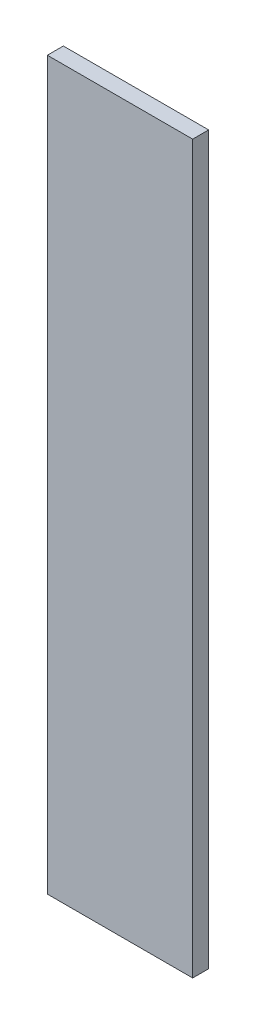
ISO-10303-21;
HEADER;
FILE_DESCRIPTION(('STEP AP214'),'2;1');
FILE_NAME('part.step','',(''),(''),'','','');
FILE_SCHEMA(('AUTOMOTIVE_DESIGN { 1 0 10303 214 1 1 1 1 }'));
ENDSEC;
DATA;
#1=APPLICATION_CONTEXT('core data for automotive mechanical design processes');
#2=APPLICATION_PROTOCOL_DEFINITION('international standard','automotive_design',2000,#1);
#3=PRODUCT_CONTEXT('',#1,'mechanical');
#4=PRODUCT('Part','Part','',(#3));
#5=PRODUCT_RELATED_PRODUCT_CATEGORY('part','',(#4));
#6=PRODUCT_DEFINITION_FORMATION('','',#4);
#7=PRODUCT_DEFINITION_CONTEXT('part definition',#1,'design');
#8=PRODUCT_DEFINITION('design','',#6,#7);
#9=PRODUCT_DEFINITION_SHAPE('','',#8);
#10=(LENGTH_UNIT() NAMED_UNIT(*) SI_UNIT(.MILLI.,.METRE.));
#11=(NAMED_UNIT(*) PLANE_ANGLE_UNIT() SI_UNIT($,.RADIAN.));
#12=(NAMED_UNIT(*) SI_UNIT($,.STERADIAN.) SOLID_ANGLE_UNIT());
#13=UNCERTAINTY_MEASURE_WITH_UNIT(LENGTH_MEASURE(1.E-05),#10,'distance_accuracy_value','');
#14=(GEOMETRIC_REPRESENTATION_CONTEXT(3) GLOBAL_UNCERTAINTY_ASSIGNED_CONTEXT((#13)) GLOBAL_UNIT_ASSIGNED_CONTEXT((#10,
#11,#12)) REPRESENTATION_CONTEXT('',''));
#15=CARTESIAN_POINT('',(0.,0.,0.));
#16=DIRECTION('',(0.,0.,1.));
#17=DIRECTION('',(1.,0.,0.));
#18=AXIS2_PLACEMENT_3D('',#15,#16,#17);
#19=CARTESIAN_POINT('',(-200.01,-0.00999999999997669,11.));
#20=DIRECTION('',(0.,0.,1.));
#21=DIRECTION('',(1.,0.,0.));
#22=AXIS2_PLACEMENT_3D('',#19,#20,#21);
#23=PLANE('',#22);
#24=DIRECTION('',(1.,0.,0.));
#25=VECTOR('',#24,1.);
#26=CARTESIAN_POINT('',(-100.,1000.,11.));
#27=LINE('',#26,#25);
#28=CARTESIAN_POINT('',(-200.,1000.,11.));
#29=VERTEX_POINT('',#28);
#30=CARTESIAN_POINT('',(0.,1000.,11.));
#31=VERTEX_POINT('',#30);
#32=EDGE_CURVE('E69',#29,#31,#27,.T.);
#33=ORIENTED_EDGE('',*,*,#32,.F.);
#34=DIRECTION('',(0.,1.,0.));
#35=VECTOR('',#34,1.);
#36=CARTESIAN_POINT('',(-200.,500.,11.));
#37=LINE('',#36,#35);
#38=CARTESIAN_POINT('',(-200.,0.,11.));
#39=VERTEX_POINT('',#38);
#40=EDGE_CURVE('E56',#39,#29,#37,.T.);
#41=ORIENTED_EDGE('',*,*,#40,.F.);
#42=DIRECTION('',(-1.,0.,0.));
#43=VECTOR('',#42,1.);
#44=CARTESIAN_POINT('',(-100.,0.,11.));
#45=LINE('',#44,#43);
#46=CARTESIAN_POINT('',(0.,0.,11.));
#47=VERTEX_POINT('',#46);
#48=EDGE_CURVE('E21',#47,#39,#45,.T.);
#49=ORIENTED_EDGE('',*,*,#48,.F.);
#50=DIRECTION('',(0.,-1.,0.));
#51=VECTOR('',#50,1.);
#52=CARTESIAN_POINT('',(0.,500.,11.));
#53=LINE('',#52,#51);
#54=EDGE_CURVE('E81',#31,#47,#53,.T.);
#55=ORIENTED_EDGE('',*,*,#54,.F.);
#56=EDGE_LOOP('',(#33,#41,#49,#55));
#57=FACE_BOUND('',#56,.T.);
#58=ADVANCED_FACE('F17',(#57),#23,.T.);
#59=CARTESIAN_POINT('',(-200.01,0.,-11.01));
#60=DIRECTION('',(0.,-1.,0.));
#61=DIRECTION('',(1.,0.,0.));
#62=AXIS2_PLACEMENT_3D('',#59,#60,#61);
#63=PLANE('',#62);
#64=DIRECTION('',(0.,0.,1.));
#65=VECTOR('',#64,1.);
#66=CARTESIAN_POINT('',(-200.,1.09170688439818E-13,0.));
#67=LINE('',#66,#65);
#68=CARTESIAN_POINT('',(-200.,0.,-11.));
#69=VERTEX_POINT('',#68);
#70=EDGE_CURVE('E62',#69,#39,#67,.T.);
#71=ORIENTED_EDGE('',*,*,#70,.F.);
#72=DIRECTION('',(-1.,0.,0.));
#73=VECTOR('',#72,1.);
#74=CARTESIAN_POINT('',(-100.,0.,-11.));
#75=LINE('',#74,#73);
#76=CARTESIAN_POINT('',(0.,0.,-11.));
#77=VERTEX_POINT('',#76);
#78=EDGE_CURVE('E84',#77,#69,#75,.T.);
#79=ORIENTED_EDGE('',*,*,#78,.F.);
#80=DIRECTION('',(0.,0.,-1.));
#81=VECTOR('',#80,1.);
#82=CARTESIAN_POINT('',(0.,0.,0.));
#83=LINE('',#82,#81);
#84=EDGE_CURVE('E65',#47,#77,#83,.T.);
#85=ORIENTED_EDGE('',*,*,#84,.F.);
#86=ORIENTED_EDGE('',*,*,#48,.T.);
#87=EDGE_LOOP('',(#71,#79,#85,#86));
#88=FACE_BOUND('',#87,.T.);
#89=ADVANCED_FACE('F61',(#88),#63,.T.);
#90=CARTESIAN_POINT('',(-200.,1000.01,-11.01));
#91=DIRECTION('',(-1.,0.,0.));
#92=DIRECTION('',(0.,-1.,0.));
#93=AXIS2_PLACEMENT_3D('',#90,#91,#92);
#94=PLANE('',#93);
#95=DIRECTION('',(0.,0.,1.));
#96=VECTOR('',#95,1.);
#97=CARTESIAN_POINT('',(-200.,1000.,0.));
#98=LINE('',#97,#96);
#99=CARTESIAN_POINT('',(-200.,1000.,-11.));
#100=VERTEX_POINT('',#99);
#101=EDGE_CURVE('E71',#100,#29,#98,.T.);
#102=ORIENTED_EDGE('',*,*,#101,.F.);
#103=DIRECTION('',(0.,1.,0.));
#104=VECTOR('',#103,1.);
#105=CARTESIAN_POINT('',(-200.,500.,-11.));
#106=LINE('',#105,#104);
#107=EDGE_CURVE('E75',#69,#100,#106,.T.);
#108=ORIENTED_EDGE('',*,*,#107,.F.);
#109=ORIENTED_EDGE('',*,*,#70,.T.);
#110=ORIENTED_EDGE('',*,*,#40,.T.);
#111=EDGE_LOOP('',(#102,#108,#109,#110));
#112=FACE_BOUND('',#111,.T.);
#113=ADVANCED_FACE('F73',(#112),#94,.T.);
#114=CARTESIAN_POINT('',(0.01,1000.,-11.01));
#115=DIRECTION('',(0.,1.,0.));
#116=DIRECTION('',(-1.,0.,0.));
#117=AXIS2_PLACEMENT_3D('',#114,#115,#116);
#118=PLANE('',#117);
#119=DIRECTION('',(0.,0.,1.));
#120=VECTOR('',#119,1.);
#121=CARTESIAN_POINT('',(0.,1000.,0.));
#122=LINE('',#121,#120);
#123=CARTESIAN_POINT('',(0.,1000.,-11.));
#124=VERTEX_POINT('',#123);
#125=EDGE_CURVE('E36',#124,#31,#122,.T.);
#126=ORIENTED_EDGE('',*,*,#125,.F.);
#127=DIRECTION('',(1.,0.,0.));
#128=VECTOR('',#127,1.);
#129=CARTESIAN_POINT('',(-100.,1000.,-11.));
#130=LINE('',#129,#128);
#131=EDGE_CURVE('E27',#100,#124,#130,.T.);
#132=ORIENTED_EDGE('',*,*,#131,.F.);
#133=ORIENTED_EDGE('',*,*,#101,.T.);
#134=ORIENTED_EDGE('',*,*,#32,.T.);
#135=EDGE_LOOP('',(#126,#132,#133,#134));
#136=FACE_BOUND('',#135,.T.);
#137=ADVANCED_FACE('F89',(#136),#118,.T.);
#138=CARTESIAN_POINT('',(0.,-0.01,-11.01));
#139=DIRECTION('',(1.,0.,0.));
#140=DIRECTION('',(0.,1.,0.));
#141=AXIS2_PLACEMENT_3D('',#138,#139,#140);
#142=PLANE('',#141);
#143=ORIENTED_EDGE('',*,*,#84,.T.);
#144=DIRECTION('',(0.,-1.,0.));
#145=VECTOR('',#144,1.);
#146=CARTESIAN_POINT('',(0.,500.,-11.));
#147=LINE('',#146,#145);
#148=EDGE_CURVE('E11',#124,#77,#147,.T.);
#149=ORIENTED_EDGE('',*,*,#148,.F.);
#150=ORIENTED_EDGE('',*,*,#125,.T.);
#151=ORIENTED_EDGE('',*,*,#54,.T.);
#152=EDGE_LOOP('',(#143,#149,#150,#151));
#153=FACE_BOUND('',#152,.T.);
#154=ADVANCED_FACE('F91',(#153),#142,.T.);
#155=CARTESIAN_POINT('',(0.00999999999999446,-0.00999999999997669,-11.));
#156=DIRECTION('',(0.,0.,-1.));
#157=DIRECTION('',(-1.,0.,0.));
#158=AXIS2_PLACEMENT_3D('',#155,#156,#157);
#159=PLANE('',#158);
#160=ORIENTED_EDGE('',*,*,#131,.T.);
#161=ORIENTED_EDGE('',*,*,#148,.T.);
#162=ORIENTED_EDGE('',*,*,#78,.T.);
#163=ORIENTED_EDGE('',*,*,#107,.T.);
#164=EDGE_LOOP('',(#160,#161,#162,#163));
#165=FACE_BOUND('',#164,.T.);
#166=ADVANCED_FACE('F19',(#165),#159,.T.);
#167=CLOSED_SHELL('',(#58,#89,#113,#137,#154,#166));
#168=MANIFOLD_SOLID_BREP('B1',#167);
#169=ADVANCED_BREP_SHAPE_REPRESENTATION('',(#18,#168),#14);
#170=SHAPE_DEFINITION_REPRESENTATION(#9,#169);
ENDSEC;
END-ISO-10303-21;
